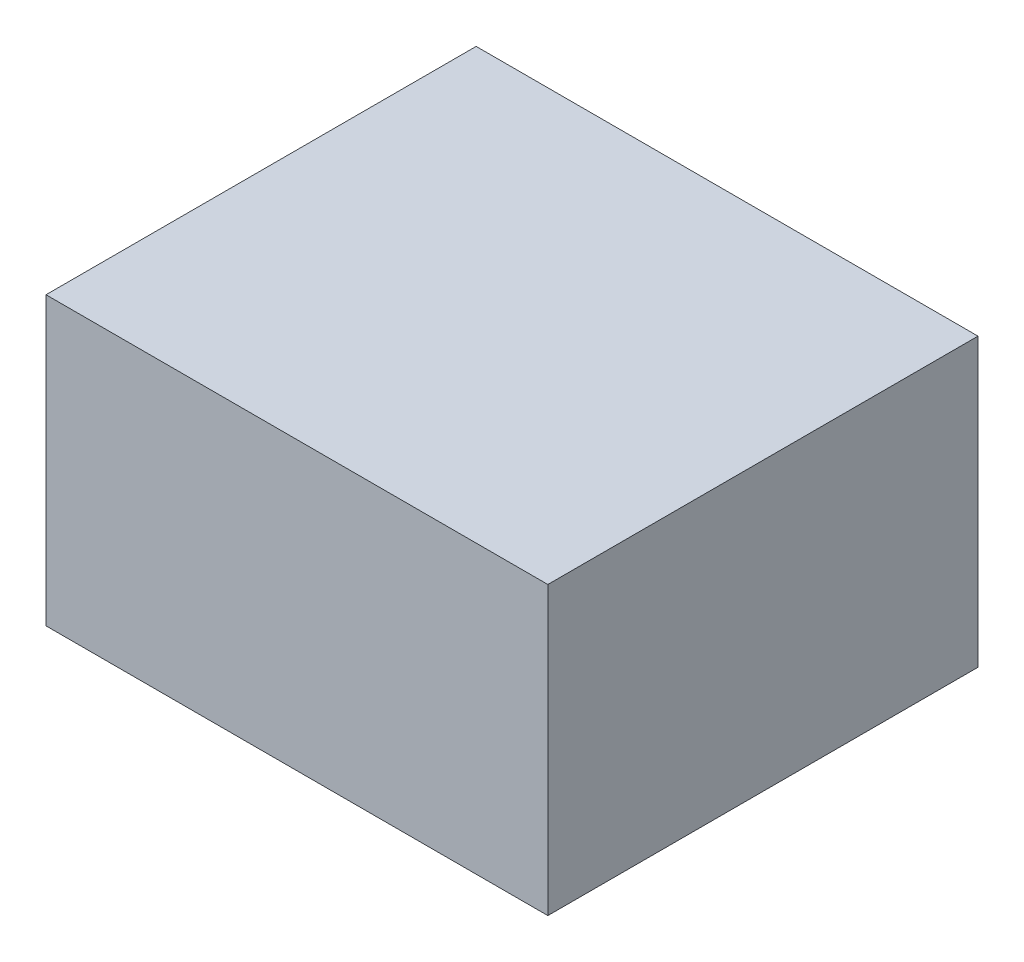
ISO-10303-21;
HEADER;
FILE_DESCRIPTION(('STEP AP214'),'2;1');
FILE_NAME('part.step','',(''),(''),'','','');
FILE_SCHEMA(('AUTOMOTIVE_DESIGN { 1 0 10303 214 1 1 1 1 }'));
ENDSEC;
DATA;
#1=APPLICATION_CONTEXT('core data for automotive mechanical design processes');
#2=APPLICATION_PROTOCOL_DEFINITION('international standard','automotive_design',2000,#1);
#3=PRODUCT_CONTEXT('',#1,'mechanical');
#4=PRODUCT('Part','Part','',(#3));
#5=PRODUCT_RELATED_PRODUCT_CATEGORY('part','',(#4));
#6=PRODUCT_DEFINITION_FORMATION('','',#4);
#7=PRODUCT_DEFINITION_CONTEXT('part definition',#1,'design');
#8=PRODUCT_DEFINITION('design','',#6,#7);
#9=PRODUCT_DEFINITION_SHAPE('','',#8);
#10=(LENGTH_UNIT() NAMED_UNIT(*) SI_UNIT(.MILLI.,.METRE.));
#11=(NAMED_UNIT(*) PLANE_ANGLE_UNIT() SI_UNIT($,.RADIAN.));
#12=(NAMED_UNIT(*) SI_UNIT($,.STERADIAN.) SOLID_ANGLE_UNIT());
#13=UNCERTAINTY_MEASURE_WITH_UNIT(LENGTH_MEASURE(1.E-05),#10,'distance_accuracy_value','');
#14=(GEOMETRIC_REPRESENTATION_CONTEXT(3) GLOBAL_UNCERTAINTY_ASSIGNED_CONTEXT((#13)) GLOBAL_UNIT_ASSIGNED_CONTEXT((#10,
#11,#12)) REPRESENTATION_CONTEXT('',''));
#15=CARTESIAN_POINT('',(0.,0.,0.));
#16=DIRECTION('',(0.,0.,1.));
#17=DIRECTION('',(1.,0.,0.));
#18=AXIS2_PLACEMENT_3D('',#15,#16,#17);
#19=CARTESIAN_POINT('',(-7.,8.,-6.));
#20=DIRECTION('',(1.,0.,0.));
#21=DIRECTION('',(0.,0.,-1.));
#22=AXIS2_PLACEMENT_3D('',#19,#20,#21);
#23=PLANE('',#22);
#24=DIRECTION('',(0.,0.,1.));
#25=VECTOR('',#24,1.);
#26=CARTESIAN_POINT('',(-7.,0.,-6.));
#27=LINE('',#26,#25);
#28=CARTESIAN_POINT('',(-7.,0.,-6.));
#29=VERTEX_POINT('',#28);
#30=CARTESIAN_POINT('',(-7.,0.,6.));
#31=VERTEX_POINT('',#30);
#32=EDGE_CURVE('E107',#29,#31,#27,.T.);
#33=ORIENTED_EDGE('',*,*,#32,.T.);
#34=DIRECTION('',(0.,-1.,0.));
#35=VECTOR('',#34,1.);
#36=CARTESIAN_POINT('',(-7.,8.,6.));
#37=LINE('',#36,#35);
#38=CARTESIAN_POINT('',(-7.,8.,6.));
#39=VERTEX_POINT('',#38);
#40=EDGE_CURVE('E11',#39,#31,#37,.T.);
#41=ORIENTED_EDGE('',*,*,#40,.F.);
#42=DIRECTION('',(0.,0.,1.));
#43=VECTOR('',#42,1.);
#44=CARTESIAN_POINT('',(-7.,8.,-6.));
#45=LINE('',#44,#43);
#46=CARTESIAN_POINT('',(-7.,8.,-6.));
#47=VERTEX_POINT('',#46);
#48=EDGE_CURVE('E92',#47,#39,#45,.T.);
#49=ORIENTED_EDGE('',*,*,#48,.F.);
#50=DIRECTION('',(0.,-1.,0.));
#51=VECTOR('',#50,1.);
#52=CARTESIAN_POINT('',(-7.,8.,-6.));
#53=LINE('',#52,#51);
#54=EDGE_CURVE('E105',#47,#29,#53,.T.);
#55=ORIENTED_EDGE('',*,*,#54,.T.);
#56=EDGE_LOOP('',(#33,#41,#49,#55));
#57=FACE_BOUND('',#56,.T.);
#58=ADVANCED_FACE('F43',(#57),#23,.F.);
#59=CARTESIAN_POINT('',(-7.,8.,6.));
#60=DIRECTION('',(0.,0.,-1.));
#61=DIRECTION('',(-1.,0.,0.));
#62=AXIS2_PLACEMENT_3D('',#59,#60,#61);
#63=PLANE('',#62);
#64=DIRECTION('',(1.,0.,0.));
#65=VECTOR('',#64,1.);
#66=CARTESIAN_POINT('',(-7.,0.,6.));
#67=LINE('',#66,#65);
#68=CARTESIAN_POINT('',(7.,0.,6.));
#69=VERTEX_POINT('',#68);
#70=EDGE_CURVE('E97',#31,#69,#67,.T.);
#71=ORIENTED_EDGE('',*,*,#70,.T.);
#72=DIRECTION('',(0.,-1.,0.));
#73=VECTOR('',#72,1.);
#74=CARTESIAN_POINT('',(7.,8.,6.));
#75=LINE('',#74,#73);
#76=CARTESIAN_POINT('',(7.,8.,6.));
#77=VERTEX_POINT('',#76);
#78=EDGE_CURVE('E51',#77,#69,#75,.T.);
#79=ORIENTED_EDGE('',*,*,#78,.F.);
#80=DIRECTION('',(1.,0.,0.));
#81=VECTOR('',#80,1.);
#82=CARTESIAN_POINT('',(-7.,8.,6.));
#83=LINE('',#82,#81);
#84=EDGE_CURVE('E87',#39,#77,#83,.T.);
#85=ORIENTED_EDGE('',*,*,#84,.F.);
#86=ORIENTED_EDGE('',*,*,#40,.T.);
#87=EDGE_LOOP('',(#71,#79,#85,#86));
#88=FACE_BOUND('',#87,.T.);
#89=ADVANCED_FACE('F100',(#88),#63,.F.);
#90=CARTESIAN_POINT('',(7.,8.,6.));
#91=DIRECTION('',(-1.,0.,0.));
#92=DIRECTION('',(0.,0.,1.));
#93=AXIS2_PLACEMENT_3D('',#90,#91,#92);
#94=PLANE('',#93);
#95=DIRECTION('',(0.,0.,-1.));
#96=VECTOR('',#95,1.);
#97=CARTESIAN_POINT('',(7.,0.,6.));
#98=LINE('',#97,#96);
#99=CARTESIAN_POINT('',(7.,0.,-6.));
#100=VERTEX_POINT('',#99);
#101=EDGE_CURVE('E78',#69,#100,#98,.T.);
#102=ORIENTED_EDGE('',*,*,#101,.T.);
#103=DIRECTION('',(0.,-1.,0.));
#104=VECTOR('',#103,1.);
#105=CARTESIAN_POINT('',(7.,8.,-6.));
#106=LINE('',#105,#104);
#107=CARTESIAN_POINT('',(7.,8.,-6.));
#108=VERTEX_POINT('',#107);
#109=EDGE_CURVE('E98',#108,#100,#106,.T.);
#110=ORIENTED_EDGE('',*,*,#109,.F.);
#111=DIRECTION('',(0.,0.,-1.));
#112=VECTOR('',#111,1.);
#113=CARTESIAN_POINT('',(7.,8.,6.));
#114=LINE('',#113,#112);
#115=EDGE_CURVE('E95',#77,#108,#114,.T.);
#116=ORIENTED_EDGE('',*,*,#115,.F.);
#117=ORIENTED_EDGE('',*,*,#78,.T.);
#118=EDGE_LOOP('',(#102,#110,#116,#117));
#119=FACE_BOUND('',#118,.T.);
#120=ADVANCED_FACE('F99',(#119),#94,.F.);
#121=CARTESIAN_POINT('',(7.,8.,-6.));
#122=DIRECTION('',(0.,0.,1.));
#123=DIRECTION('',(1.,0.,0.));
#124=AXIS2_PLACEMENT_3D('',#121,#122,#123);
#125=PLANE('',#124);
#126=DIRECTION('',(-1.,0.,0.));
#127=VECTOR('',#126,1.);
#128=CARTESIAN_POINT('',(7.,0.,-6.));
#129=LINE('',#128,#127);
#130=EDGE_CURVE('E85',#100,#29,#129,.T.);
#131=ORIENTED_EDGE('',*,*,#130,.T.);
#132=ORIENTED_EDGE('',*,*,#54,.F.);
#133=DIRECTION('',(-1.,0.,0.));
#134=VECTOR('',#133,1.);
#135=CARTESIAN_POINT('',(7.,8.,-6.));
#136=LINE('',#135,#134);
#137=EDGE_CURVE('E56',#108,#47,#136,.T.);
#138=ORIENTED_EDGE('',*,*,#137,.F.);
#139=ORIENTED_EDGE('',*,*,#109,.T.);
#140=EDGE_LOOP('',(#131,#132,#138,#139));
#141=FACE_BOUND('',#140,.T.);
#142=ADVANCED_FACE('F111',(#141),#125,.F.);
#143=CARTESIAN_POINT('',(0.,8.,0.));
#144=DIRECTION('',(0.,1.,0.));
#145=DIRECTION('',(0.,0.,1.));
#146=AXIS2_PLACEMENT_3D('',#143,#144,#145);
#147=PLANE('',#146);
#148=ORIENTED_EDGE('',*,*,#48,.T.);
#149=ORIENTED_EDGE('',*,*,#84,.T.);
#150=ORIENTED_EDGE('',*,*,#115,.T.);
#151=ORIENTED_EDGE('',*,*,#137,.T.);
#152=EDGE_LOOP('',(#148,#149,#150,#151));
#153=FACE_BOUND('',#152,.T.);
#154=ADVANCED_FACE('F89',(#153),#147,.T.);
#155=CARTESIAN_POINT('',(0.,0.,0.));
#156=DIRECTION('',(0.,1.,0.));
#157=DIRECTION('',(0.,0.,1.));
#158=AXIS2_PLACEMENT_3D('',#155,#156,#157);
#159=PLANE('',#158);
#160=ORIENTED_EDGE('',*,*,#32,.F.);
#161=ORIENTED_EDGE('',*,*,#130,.F.);
#162=ORIENTED_EDGE('',*,*,#101,.F.);
#163=ORIENTED_EDGE('',*,*,#70,.F.);
#164=EDGE_LOOP('',(#160,#161,#162,#163));
#165=FACE_BOUND('',#164,.T.);
#166=ADVANCED_FACE('F117',(#165),#159,.F.);
#167=CLOSED_SHELL('',(#58,#89,#120,#142,#154,#166));
#168=MANIFOLD_SOLID_BREP('B2',#167);
#169=ADVANCED_BREP_SHAPE_REPRESENTATION('',(#18,#168),#14);
#170=SHAPE_DEFINITION_REPRESENTATION(#9,#169);
ENDSEC;
END-ISO-10303-21;
